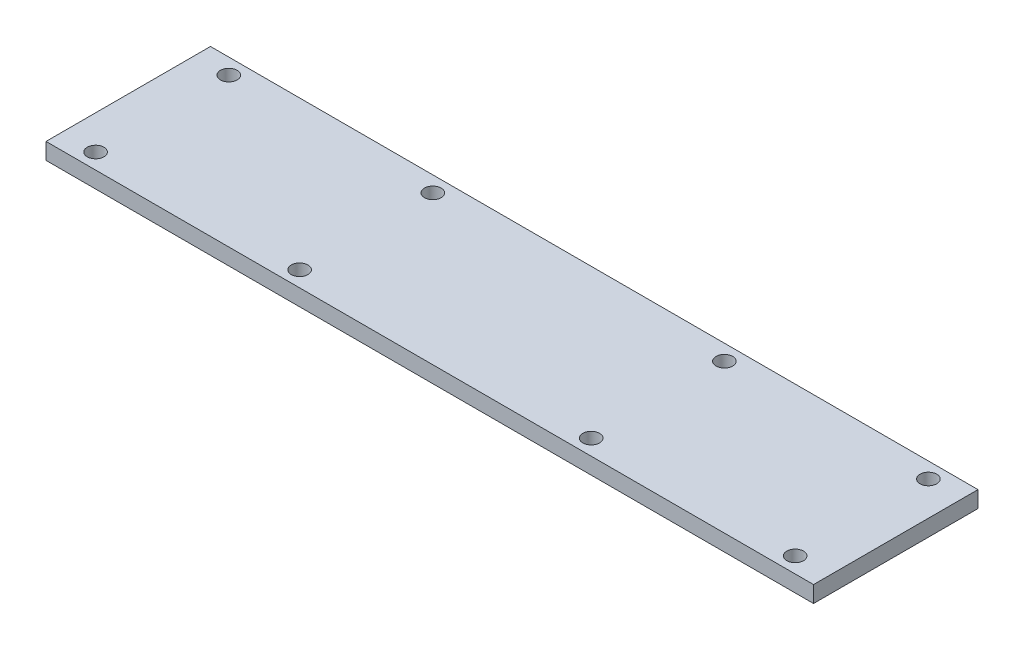
ISO-10303-21;
HEADER;
FILE_DESCRIPTION(('STEP AP214'),'2;1');
FILE_NAME('part.step','',(''),(''),'','','');
FILE_SCHEMA(('AUTOMOTIVE_DESIGN { 1 0 10303 214 1 1 1 1 }'));
ENDSEC;
DATA;
#1=APPLICATION_CONTEXT('core data for automotive mechanical design processes');
#2=APPLICATION_PROTOCOL_DEFINITION('international standard','automotive_design',2000,#1);
#3=PRODUCT_CONTEXT('',#1,'mechanical');
#4=PRODUCT('Part','Part','',(#3));
#5=PRODUCT_RELATED_PRODUCT_CATEGORY('part','',(#4));
#6=PRODUCT_DEFINITION_FORMATION('','',#4);
#7=PRODUCT_DEFINITION_CONTEXT('part definition',#1,'design');
#8=PRODUCT_DEFINITION('design','',#6,#7);
#9=PRODUCT_DEFINITION_SHAPE('','',#8);
#10=(LENGTH_UNIT() NAMED_UNIT(*) SI_UNIT(.MILLI.,.METRE.));
#11=(NAMED_UNIT(*) PLANE_ANGLE_UNIT() SI_UNIT($,.RADIAN.));
#12=(NAMED_UNIT(*) SI_UNIT($,.STERADIAN.) SOLID_ANGLE_UNIT());
#13=UNCERTAINTY_MEASURE_WITH_UNIT(LENGTH_MEASURE(1.E-05),#10,'distance_accuracy_value','');
#14=(GEOMETRIC_REPRESENTATION_CONTEXT(3) GLOBAL_UNCERTAINTY_ASSIGNED_CONTEXT((#13)) GLOBAL_UNIT_ASSIGNED_CONTEXT((#10,
#11,#12)) REPRESENTATION_CONTEXT('',''));
#15=CARTESIAN_POINT('',(0.,0.,0.));
#16=DIRECTION('',(0.,0.,1.));
#17=DIRECTION('',(1.,0.,0.));
#18=AXIS2_PLACEMENT_3D('',#15,#16,#17);
#19=CARTESIAN_POINT('',(0.,3.,0.));
#20=DIRECTION('',(0.,-1.,0.));
#21=DIRECTION('',(0.,0.,-1.));
#22=AXIS2_PLACEMENT_3D('',#19,#20,#21);
#23=PLANE('',#22);
#24=DIRECTION('',(0.,0.,-1.));
#25=VECTOR('',#24,1.);
#26=CARTESIAN_POINT('',(70.,3.,15.));
#27=LINE('',#26,#25);
#28=CARTESIAN_POINT('',(70.,3.,15.));
#29=VERTEX_POINT('',#28);
#30=CARTESIAN_POINT('',(70.,3.,-15.));
#31=VERTEX_POINT('',#30);
#32=EDGE_CURVE('E87',#29,#31,#27,.T.);
#33=ORIENTED_EDGE('',*,*,#32,.T.);
#34=DIRECTION('',(-1.,0.,0.));
#35=VECTOR('',#34,1.);
#36=CARTESIAN_POINT('',(-70.,3.,-15.));
#37=LINE('',#36,#35);
#38=CARTESIAN_POINT('',(-70.,3.,-15.));
#39=VERTEX_POINT('',#38);
#40=EDGE_CURVE('E82',#31,#39,#37,.T.);
#41=ORIENTED_EDGE('',*,*,#40,.T.);
#42=DIRECTION('',(0.,0.,1.));
#43=VECTOR('',#42,1.);
#44=CARTESIAN_POINT('',(-70.,3.,15.));
#45=LINE('',#44,#43);
#46=CARTESIAN_POINT('',(-70.,3.,15.));
#47=VERTEX_POINT('',#46);
#48=EDGE_CURVE('E85',#39,#47,#45,.T.);
#49=ORIENTED_EDGE('',*,*,#48,.T.);
#50=DIRECTION('',(1.,0.,0.));
#51=VECTOR('',#50,1.);
#52=CARTESIAN_POINT('',(-70.,3.,15.));
#53=LINE('',#52,#51);
#54=EDGE_CURVE('E52',#47,#29,#53,.T.);
#55=ORIENTED_EDGE('',*,*,#54,.T.);
#56=EDGE_LOOP('',(#33,#41,#49,#55));
#57=FACE_BOUND('',#56,.T.);
#58=CARTESIAN_POINT('',(-63.8,3.,-12.15));
#59=DIRECTION('',(0.,1.,0.));
#60=DIRECTION('',(0.,0.,1.));
#61=AXIS2_PLACEMENT_3D('',#58,#59,#60);
#62=CIRCLE('',#61,1.525);
#63=CARTESIAN_POINT('',(-63.8,3.,-10.625));
#64=VERTEX_POINT('',#63);
#65=EDGE_CURVE('E102',#64,#64,#62,.T.);
#66=ORIENTED_EDGE('',*,*,#65,.F.);
#67=EDGE_LOOP('',(#66));
#68=FACE_BOUND('',#67,.T.);
#69=CARTESIAN_POINT('',(-63.8,3.,12.15));
#70=DIRECTION('',(0.,1.,0.));
#71=DIRECTION('',(0.,0.,-1.));
#72=AXIS2_PLACEMENT_3D('',#69,#70,#71);
#73=CIRCLE('',#72,1.525);
#74=CARTESIAN_POINT('',(-63.8,3.,10.625));
#75=VERTEX_POINT('',#74);
#76=EDGE_CURVE('E117',#75,#75,#73,.T.);
#77=ORIENTED_EDGE('',*,*,#76,.F.);
#78=EDGE_LOOP('',(#77));
#79=FACE_BOUND('',#78,.T.);
#80=CARTESIAN_POINT('',(63.8,3.,12.15));
#81=DIRECTION('',(0.,1.,0.));
#82=DIRECTION('',(0.,0.,1.));
#83=AXIS2_PLACEMENT_3D('',#80,#81,#82);
#84=CIRCLE('',#83,1.525);
#85=CARTESIAN_POINT('',(63.8,3.,13.675));
#86=VERTEX_POINT('',#85);
#87=EDGE_CURVE('E123',#86,#86,#84,.T.);
#88=ORIENTED_EDGE('',*,*,#87,.F.);
#89=EDGE_LOOP('',(#88));
#90=FACE_BOUND('',#89,.T.);
#91=CARTESIAN_POINT('',(63.8,3.,-12.15));
#92=DIRECTION('',(0.,1.,0.));
#93=DIRECTION('',(0.,0.,-1.));
#94=AXIS2_PLACEMENT_3D('',#91,#92,#93);
#95=CIRCLE('',#94,1.525);
#96=CARTESIAN_POINT('',(63.8,3.,-13.675));
#97=VERTEX_POINT('',#96);
#98=EDGE_CURVE('E129',#97,#97,#95,.T.);
#99=ORIENTED_EDGE('',*,*,#98,.F.);
#100=EDGE_LOOP('',(#99));
#101=FACE_BOUND('',#100,.T.);
#102=CARTESIAN_POINT('',(-26.595,3.,-12.15));
#103=DIRECTION('',(0.,1.,0.));
#104=DIRECTION('',(0.,0.,1.));
#105=AXIS2_PLACEMENT_3D('',#102,#103,#104);
#106=CIRCLE('',#105,1.525);
#107=CARTESIAN_POINT('',(-26.595,3.,-10.625));
#108=VERTEX_POINT('',#107);
#109=EDGE_CURVE('E135',#108,#108,#106,.T.);
#110=ORIENTED_EDGE('',*,*,#109,.F.);
#111=EDGE_LOOP('',(#110));
#112=FACE_BOUND('',#111,.T.);
#113=CARTESIAN_POINT('',(-26.595,3.,12.15));
#114=DIRECTION('',(0.,1.,0.));
#115=DIRECTION('',(0.,0.,-1.));
#116=AXIS2_PLACEMENT_3D('',#113,#114,#115);
#117=CIRCLE('',#116,1.525);
#118=CARTESIAN_POINT('',(-26.595,3.,10.625));
#119=VERTEX_POINT('',#118);
#120=EDGE_CURVE('E141',#119,#119,#117,.T.);
#121=ORIENTED_EDGE('',*,*,#120,.F.);
#122=EDGE_LOOP('',(#121));
#123=FACE_BOUND('',#122,.T.);
#124=CARTESIAN_POINT('',(26.595,3.,12.15));
#125=DIRECTION('',(0.,1.,0.));
#126=DIRECTION('',(0.,0.,1.));
#127=AXIS2_PLACEMENT_3D('',#124,#125,#126);
#128=CIRCLE('',#127,1.525);
#129=CARTESIAN_POINT('',(26.595,3.,13.675));
#130=VERTEX_POINT('',#129);
#131=EDGE_CURVE('E147',#130,#130,#128,.T.);
#132=ORIENTED_EDGE('',*,*,#131,.F.);
#133=EDGE_LOOP('',(#132));
#134=FACE_BOUND('',#133,.T.);
#135=CARTESIAN_POINT('',(26.595,3.,-12.15));
#136=DIRECTION('',(0.,1.,0.));
#137=DIRECTION('',(0.,0.,-1.));
#138=AXIS2_PLACEMENT_3D('',#135,#136,#137);
#139=CIRCLE('',#138,1.525);
#140=CARTESIAN_POINT('',(26.595,3.,-13.675));
#141=VERTEX_POINT('',#140);
#142=EDGE_CURVE('E153',#141,#141,#139,.T.);
#143=ORIENTED_EDGE('',*,*,#142,.F.);
#144=EDGE_LOOP('',(#143));
#145=FACE_BOUND('',#144,.T.);
#146=ADVANCED_FACE('F35',(#57,#68,#79,#90,#101,#112,#123,#134,#145),#23,.F.);
#147=CARTESIAN_POINT('',(0.,0.,0.));
#148=DIRECTION('',(0.,-1.,0.));
#149=DIRECTION('',(0.,0.,-1.));
#150=AXIS2_PLACEMENT_3D('',#147,#148,#149);
#151=PLANE('',#150);
#152=CARTESIAN_POINT('',(26.595,0.,12.15));
#153=DIRECTION('',(0.,1.,0.));
#154=DIRECTION('',(0.,0.,1.));
#155=AXIS2_PLACEMENT_3D('',#152,#153,#154);
#156=CIRCLE('',#155,1.525);
#157=CARTESIAN_POINT('',(26.595,0.,13.675));
#158=VERTEX_POINT('',#157);
#159=EDGE_CURVE('E150',#158,#158,#156,.T.);
#160=ORIENTED_EDGE('',*,*,#159,.T.);
#161=EDGE_LOOP('',(#160));
#162=FACE_BOUND('',#161,.T.);
#163=CARTESIAN_POINT('',(-26.595,0.,-12.15));
#164=DIRECTION('',(0.,1.,0.));
#165=DIRECTION('',(0.,0.,1.));
#166=AXIS2_PLACEMENT_3D('',#163,#164,#165);
#167=CIRCLE('',#166,1.525);
#168=CARTESIAN_POINT('',(-26.595,0.,-10.625));
#169=VERTEX_POINT('',#168);
#170=EDGE_CURVE('E138',#169,#169,#167,.T.);
#171=ORIENTED_EDGE('',*,*,#170,.T.);
#172=EDGE_LOOP('',(#171));
#173=FACE_BOUND('',#172,.T.);
#174=CARTESIAN_POINT('',(63.8,0.,12.15));
#175=DIRECTION('',(0.,1.,0.));
#176=DIRECTION('',(0.,0.,1.));
#177=AXIS2_PLACEMENT_3D('',#174,#175,#176);
#178=CIRCLE('',#177,1.525);
#179=CARTESIAN_POINT('',(63.8,0.,13.675));
#180=VERTEX_POINT('',#179);
#181=EDGE_CURVE('E126',#180,#180,#178,.T.);
#182=ORIENTED_EDGE('',*,*,#181,.T.);
#183=EDGE_LOOP('',(#182));
#184=FACE_BOUND('',#183,.T.);
#185=CARTESIAN_POINT('',(-63.8,0.,-12.15));
#186=DIRECTION('',(0.,1.,0.));
#187=DIRECTION('',(0.,0.,1.));
#188=AXIS2_PLACEMENT_3D('',#185,#186,#187);
#189=CIRCLE('',#188,1.525);
#190=CARTESIAN_POINT('',(-63.8,0.,-10.625));
#191=VERTEX_POINT('',#190);
#192=EDGE_CURVE('E114',#191,#191,#189,.T.);
#193=ORIENTED_EDGE('',*,*,#192,.T.);
#194=EDGE_LOOP('',(#193));
#195=FACE_BOUND('',#194,.T.);
#196=DIRECTION('',(0.,0.,-1.));
#197=VECTOR('',#196,1.);
#198=CARTESIAN_POINT('',(70.,0.,15.));
#199=LINE('',#198,#197);
#200=CARTESIAN_POINT('',(70.,0.,15.));
#201=VERTEX_POINT('',#200);
#202=CARTESIAN_POINT('',(70.,0.,-15.));
#203=VERTEX_POINT('',#202);
#204=EDGE_CURVE('E99',#201,#203,#199,.T.);
#205=ORIENTED_EDGE('',*,*,#204,.F.);
#206=DIRECTION('',(1.,0.,0.));
#207=VECTOR('',#206,1.);
#208=CARTESIAN_POINT('',(-70.,0.,15.));
#209=LINE('',#208,#207);
#210=CARTESIAN_POINT('',(-70.,0.,15.));
#211=VERTEX_POINT('',#210);
#212=EDGE_CURVE('E75',#211,#201,#209,.T.);
#213=ORIENTED_EDGE('',*,*,#212,.F.);
#214=DIRECTION('',(0.,0.,1.));
#215=VECTOR('',#214,1.);
#216=CARTESIAN_POINT('',(-70.,0.,15.));
#217=LINE('',#216,#215);
#218=CARTESIAN_POINT('',(-70.,0.,-15.));
#219=VERTEX_POINT('',#218);
#220=EDGE_CURVE('E69',#219,#211,#217,.T.);
#221=ORIENTED_EDGE('',*,*,#220,.F.);
#222=DIRECTION('',(-1.,0.,0.));
#223=VECTOR('',#222,1.);
#224=CARTESIAN_POINT('',(-70.,0.,-15.));
#225=LINE('',#224,#223);
#226=EDGE_CURVE('E91',#203,#219,#225,.T.);
#227=ORIENTED_EDGE('',*,*,#226,.F.);
#228=EDGE_LOOP('',(#205,#213,#221,#227));
#229=FACE_BOUND('',#228,.T.);
#230=CARTESIAN_POINT('',(-63.8,0.,12.15));
#231=DIRECTION('',(0.,1.,0.));
#232=DIRECTION('',(0.,0.,-1.));
#233=AXIS2_PLACEMENT_3D('',#230,#231,#232);
#234=CIRCLE('',#233,1.525);
#235=CARTESIAN_POINT('',(-63.8,0.,10.625));
#236=VERTEX_POINT('',#235);
#237=EDGE_CURVE('E120',#236,#236,#234,.T.);
#238=ORIENTED_EDGE('',*,*,#237,.T.);
#239=EDGE_LOOP('',(#238));
#240=FACE_BOUND('',#239,.T.);
#241=CARTESIAN_POINT('',(63.8,0.,-12.15));
#242=DIRECTION('',(0.,1.,0.));
#243=DIRECTION('',(0.,0.,-1.));
#244=AXIS2_PLACEMENT_3D('',#241,#242,#243);
#245=CIRCLE('',#244,1.525);
#246=CARTESIAN_POINT('',(63.8,0.,-13.675));
#247=VERTEX_POINT('',#246);
#248=EDGE_CURVE('E132',#247,#247,#245,.T.);
#249=ORIENTED_EDGE('',*,*,#248,.T.);
#250=EDGE_LOOP('',(#249));
#251=FACE_BOUND('',#250,.T.);
#252=CARTESIAN_POINT('',(-26.595,0.,12.15));
#253=DIRECTION('',(0.,1.,0.));
#254=DIRECTION('',(0.,0.,-1.));
#255=AXIS2_PLACEMENT_3D('',#252,#253,#254);
#256=CIRCLE('',#255,1.525);
#257=CARTESIAN_POINT('',(-26.595,0.,10.625));
#258=VERTEX_POINT('',#257);
#259=EDGE_CURVE('E144',#258,#258,#256,.T.);
#260=ORIENTED_EDGE('',*,*,#259,.T.);
#261=EDGE_LOOP('',(#260));
#262=FACE_BOUND('',#261,.T.);
#263=CARTESIAN_POINT('',(26.595,0.,-12.15));
#264=DIRECTION('',(0.,1.,0.));
#265=DIRECTION('',(0.,0.,-1.));
#266=AXIS2_PLACEMENT_3D('',#263,#264,#265);
#267=CIRCLE('',#266,1.525);
#268=CARTESIAN_POINT('',(26.595,0.,-13.675));
#269=VERTEX_POINT('',#268);
#270=EDGE_CURVE('E156',#269,#269,#267,.T.);
#271=ORIENTED_EDGE('',*,*,#270,.T.);
#272=EDGE_LOOP('',(#271));
#273=FACE_BOUND('',#272,.T.);
#274=ADVANCED_FACE('F110',(#162,#173,#184,#195,#229,#240,#251,#262,#273),#151,.T.);
#275=CARTESIAN_POINT('',(70.,3.,15.));
#276=DIRECTION('',(-1.,0.,0.));
#277=DIRECTION('',(0.,0.,1.));
#278=AXIS2_PLACEMENT_3D('',#275,#276,#277);
#279=PLANE('',#278);
#280=ORIENTED_EDGE('',*,*,#204,.T.);
#281=DIRECTION('',(0.,-1.,0.));
#282=VECTOR('',#281,1.);
#283=CARTESIAN_POINT('',(70.,3.,-15.));
#284=LINE('',#283,#282);
#285=EDGE_CURVE('E11',#31,#203,#284,.T.);
#286=ORIENTED_EDGE('',*,*,#285,.F.);
#287=ORIENTED_EDGE('',*,*,#32,.F.);
#288=DIRECTION('',(0.,-1.,0.));
#289=VECTOR('',#288,1.);
#290=CARTESIAN_POINT('',(70.,3.,15.));
#291=LINE('',#290,#289);
#292=EDGE_CURVE('E95',#29,#201,#291,.T.);
#293=ORIENTED_EDGE('',*,*,#292,.T.);
#294=EDGE_LOOP('',(#280,#286,#287,#293));
#295=FACE_BOUND('',#294,.T.);
#296=ADVANCED_FACE('F37',(#295),#279,.F.);
#297=CARTESIAN_POINT('',(-70.,3.,-15.));
#298=DIRECTION('',(0.,0.,1.));
#299=DIRECTION('',(1.,0.,0.));
#300=AXIS2_PLACEMENT_3D('',#297,#298,#299);
#301=PLANE('',#300);
#302=ORIENTED_EDGE('',*,*,#226,.T.);
#303=DIRECTION('',(0.,-1.,0.));
#304=VECTOR('',#303,1.);
#305=CARTESIAN_POINT('',(-70.,3.,-15.));
#306=LINE('',#305,#304);
#307=EDGE_CURVE('E44',#39,#219,#306,.T.);
#308=ORIENTED_EDGE('',*,*,#307,.F.);
#309=ORIENTED_EDGE('',*,*,#40,.F.);
#310=ORIENTED_EDGE('',*,*,#285,.T.);
#311=EDGE_LOOP('',(#302,#308,#309,#310));
#312=FACE_BOUND('',#311,.T.);
#313=ADVANCED_FACE('F90',(#312),#301,.F.);
#314=CARTESIAN_POINT('',(-70.,3.,15.));
#315=DIRECTION('',(1.,0.,0.));
#316=DIRECTION('',(0.,0.,-1.));
#317=AXIS2_PLACEMENT_3D('',#314,#315,#316);
#318=PLANE('',#317);
#319=ORIENTED_EDGE('',*,*,#220,.T.);
#320=DIRECTION('',(0.,-1.,0.));
#321=VECTOR('',#320,1.);
#322=CARTESIAN_POINT('',(-70.,3.,15.));
#323=LINE('',#322,#321);
#324=EDGE_CURVE('E92',#47,#211,#323,.T.);
#325=ORIENTED_EDGE('',*,*,#324,.F.);
#326=ORIENTED_EDGE('',*,*,#48,.F.);
#327=ORIENTED_EDGE('',*,*,#307,.T.);
#328=EDGE_LOOP('',(#319,#325,#326,#327));
#329=FACE_BOUND('',#328,.T.);
#330=ADVANCED_FACE('F93',(#329),#318,.F.);
#331=CARTESIAN_POINT('',(-70.,3.,15.));
#332=DIRECTION('',(0.,0.,-1.));
#333=DIRECTION('',(-1.,0.,0.));
#334=AXIS2_PLACEMENT_3D('',#331,#332,#333);
#335=PLANE('',#334);
#336=ORIENTED_EDGE('',*,*,#212,.T.);
#337=ORIENTED_EDGE('',*,*,#292,.F.);
#338=ORIENTED_EDGE('',*,*,#54,.F.);
#339=ORIENTED_EDGE('',*,*,#324,.T.);
#340=EDGE_LOOP('',(#336,#337,#338,#339));
#341=FACE_BOUND('',#340,.T.);
#342=ADVANCED_FACE('F107',(#341),#335,.F.);
#343=CARTESIAN_POINT('',(-63.8,3.,-12.15));
#344=DIRECTION('',(0.,-1.,0.));
#345=DIRECTION('',(0.,0.,-1.));
#346=AXIS2_PLACEMENT_3D('',#343,#344,#345);
#347=CYLINDRICAL_SURFACE('',#346,1.525);
#348=ORIENTED_EDGE('',*,*,#65,.T.);
#349=EDGE_LOOP('',(#348));
#350=FACE_BOUND('',#349,.T.);
#351=ORIENTED_EDGE('',*,*,#192,.F.);
#352=EDGE_LOOP('',(#351));
#353=FACE_BOUND('',#352,.T.);
#354=ADVANCED_FACE('F173',(#350,#353),#347,.F.);
#355=CARTESIAN_POINT('',(-63.8,3.,12.15));
#356=DIRECTION('',(0.,-1.,0.));
#357=DIRECTION('',(0.,0.,-1.));
#358=AXIS2_PLACEMENT_3D('',#355,#356,#357);
#359=CYLINDRICAL_SURFACE('',#358,1.525);
#360=ORIENTED_EDGE('',*,*,#76,.T.);
#361=EDGE_LOOP('',(#360));
#362=FACE_BOUND('',#361,.T.);
#363=ORIENTED_EDGE('',*,*,#237,.F.);
#364=EDGE_LOOP('',(#363));
#365=FACE_BOUND('',#364,.T.);
#366=ADVANCED_FACE('F219',(#362,#365),#359,.F.);
#367=CARTESIAN_POINT('',(63.8,3.,12.15));
#368=DIRECTION('',(0.,-1.,0.));
#369=DIRECTION('',(0.,0.,-1.));
#370=AXIS2_PLACEMENT_3D('',#367,#368,#369);
#371=CYLINDRICAL_SURFACE('',#370,1.525);
#372=ORIENTED_EDGE('',*,*,#87,.T.);
#373=EDGE_LOOP('',(#372));
#374=FACE_BOUND('',#373,.T.);
#375=ORIENTED_EDGE('',*,*,#181,.F.);
#376=EDGE_LOOP('',(#375));
#377=FACE_BOUND('',#376,.T.);
#378=ADVANCED_FACE('F227',(#374,#377),#371,.F.);
#379=CARTESIAN_POINT('',(63.8,3.,-12.15));
#380=DIRECTION('',(0.,-1.,0.));
#381=DIRECTION('',(0.,0.,-1.));
#382=AXIS2_PLACEMENT_3D('',#379,#380,#381);
#383=CYLINDRICAL_SURFACE('',#382,1.525);
#384=ORIENTED_EDGE('',*,*,#98,.T.);
#385=EDGE_LOOP('',(#384));
#386=FACE_BOUND('',#385,.T.);
#387=ORIENTED_EDGE('',*,*,#248,.F.);
#388=EDGE_LOOP('',(#387));
#389=FACE_BOUND('',#388,.T.);
#390=ADVANCED_FACE('F235',(#386,#389),#383,.F.);
#391=CARTESIAN_POINT('',(-26.595,3.,-12.15));
#392=DIRECTION('',(0.,-1.,0.));
#393=DIRECTION('',(0.,0.,-1.));
#394=AXIS2_PLACEMENT_3D('',#391,#392,#393);
#395=CYLINDRICAL_SURFACE('',#394,1.525);
#396=ORIENTED_EDGE('',*,*,#109,.T.);
#397=EDGE_LOOP('',(#396));
#398=FACE_BOUND('',#397,.T.);
#399=ORIENTED_EDGE('',*,*,#170,.F.);
#400=EDGE_LOOP('',(#399));
#401=FACE_BOUND('',#400,.T.);
#402=ADVANCED_FACE('F244',(#398,#401),#395,.F.);
#403=CARTESIAN_POINT('',(-26.595,3.,12.15));
#404=DIRECTION('',(0.,-1.,0.));
#405=DIRECTION('',(0.,0.,-1.));
#406=AXIS2_PLACEMENT_3D('',#403,#404,#405);
#407=CYLINDRICAL_SURFACE('',#406,1.525);
#408=ORIENTED_EDGE('',*,*,#120,.T.);
#409=EDGE_LOOP('',(#408));
#410=FACE_BOUND('',#409,.T.);
#411=ORIENTED_EDGE('',*,*,#259,.F.);
#412=EDGE_LOOP('',(#411));
#413=FACE_BOUND('',#412,.T.);
#414=ADVANCED_FACE('F253',(#410,#413),#407,.F.);
#415=CARTESIAN_POINT('',(26.595,3.,12.15));
#416=DIRECTION('',(0.,-1.,0.));
#417=DIRECTION('',(0.,0.,-1.));
#418=AXIS2_PLACEMENT_3D('',#415,#416,#417);
#419=CYLINDRICAL_SURFACE('',#418,1.525);
#420=ORIENTED_EDGE('',*,*,#131,.T.);
#421=EDGE_LOOP('',(#420));
#422=FACE_BOUND('',#421,.T.);
#423=ORIENTED_EDGE('',*,*,#159,.F.);
#424=EDGE_LOOP('',(#423));
#425=FACE_BOUND('',#424,.T.);
#426=ADVANCED_FACE('F262',(#422,#425),#419,.F.);
#427=CARTESIAN_POINT('',(26.595,3.,-12.15));
#428=DIRECTION('',(0.,-1.,0.));
#429=DIRECTION('',(0.,0.,-1.));
#430=AXIS2_PLACEMENT_3D('',#427,#428,#429);
#431=CYLINDRICAL_SURFACE('',#430,1.525);
#432=ORIENTED_EDGE('',*,*,#142,.T.);
#433=EDGE_LOOP('',(#432));
#434=FACE_BOUND('',#433,.T.);
#435=ORIENTED_EDGE('',*,*,#270,.F.);
#436=EDGE_LOOP('',(#435));
#437=FACE_BOUND('',#436,.T.);
#438=ADVANCED_FACE('F162',(#434,#437),#431,.F.);
#439=CLOSED_SHELL('',(#146,#274,#296,#313,#330,#342,#354,#366,#378,#390,#402,#414,#426,#438));
#440=MANIFOLD_SOLID_BREP('B2',#439);
#441=ADVANCED_BREP_SHAPE_REPRESENTATION('',(#18,#440),#14);
#442=SHAPE_DEFINITION_REPRESENTATION(#9,#441);
ENDSEC;
END-ISO-10303-21;
